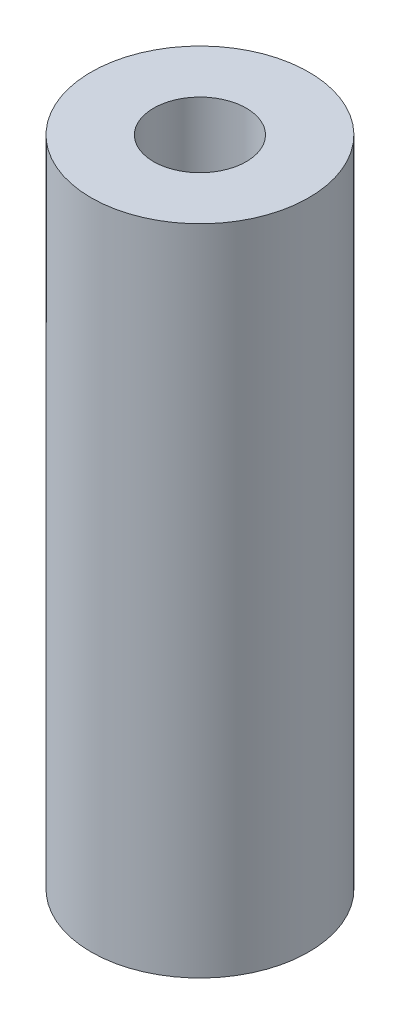
ISO-10303-21;
HEADER;
FILE_DESCRIPTION(('STEP AP214'),'2;1');
FILE_NAME('part.step','',(''),(''),'','','');
FILE_SCHEMA(('AUTOMOTIVE_DESIGN { 1 0 10303 214 1 1 1 1 }'));
ENDSEC;
DATA;
#1=APPLICATION_CONTEXT('core data for automotive mechanical design processes');
#2=APPLICATION_PROTOCOL_DEFINITION('international standard','automotive_design',2000,#1);
#3=PRODUCT_CONTEXT('',#1,'mechanical');
#4=PRODUCT('Part','Part','',(#3));
#5=PRODUCT_RELATED_PRODUCT_CATEGORY('part','',(#4));
#6=PRODUCT_DEFINITION_FORMATION('','',#4);
#7=PRODUCT_DEFINITION_CONTEXT('part definition',#1,'design');
#8=PRODUCT_DEFINITION('design','',#6,#7);
#9=PRODUCT_DEFINITION_SHAPE('','',#8);
#10=(LENGTH_UNIT() NAMED_UNIT(*) SI_UNIT(.MILLI.,.METRE.));
#11=(NAMED_UNIT(*) PLANE_ANGLE_UNIT() SI_UNIT($,.RADIAN.));
#12=(NAMED_UNIT(*) SI_UNIT($,.STERADIAN.) SOLID_ANGLE_UNIT());
#13=UNCERTAINTY_MEASURE_WITH_UNIT(LENGTH_MEASURE(1.E-05),#10,'distance_accuracy_value','');
#14=(GEOMETRIC_REPRESENTATION_CONTEXT(3) GLOBAL_UNCERTAINTY_ASSIGNED_CONTEXT((#13)) GLOBAL_UNIT_ASSIGNED_CONTEXT((#10,
#11,#12)) REPRESENTATION_CONTEXT('',''));
#15=CARTESIAN_POINT('',(0.,0.,0.));
#16=DIRECTION('',(0.,0.,1.));
#17=DIRECTION('',(1.,0.,0.));
#18=AXIS2_PLACEMENT_3D('',#15,#16,#17);
#19=CARTESIAN_POINT('',(0.,19.05,0.));
#20=DIRECTION('',(0.,-1.,0.));
#21=DIRECTION('',(0.,0.,-1.));
#22=AXIS2_PLACEMENT_3D('',#19,#20,#21);
#23=CYLINDRICAL_SURFACE('',#22,3.175);
#24=CARTESIAN_POINT('',(0.,19.05,0.));
#25=DIRECTION('',(0.,1.,0.));
#26=DIRECTION('',(0.,0.,1.));
#27=AXIS2_PLACEMENT_3D('',#24,#25,#26);
#28=CIRCLE('',#27,3.175);
#29=CARTESIAN_POINT('',(0.,19.05,3.17500000000001));
#30=VERTEX_POINT('',#29);
#31=EDGE_CURVE('E10',#30,#30,#28,.T.);
#32=ORIENTED_EDGE('',*,*,#31,.F.);
#33=EDGE_LOOP('',(#32));
#34=FACE_BOUND('',#33,.T.);
#35=CARTESIAN_POINT('',(0.,0.,0.));
#36=DIRECTION('',(0.,1.,0.));
#37=DIRECTION('',(0.,0.,1.));
#38=AXIS2_PLACEMENT_3D('',#35,#36,#37);
#39=CIRCLE('',#38,3.175);
#40=CARTESIAN_POINT('',(0.,0.,3.17500000000001));
#41=VERTEX_POINT('',#40);
#42=EDGE_CURVE('E35',#41,#41,#39,.T.);
#43=ORIENTED_EDGE('',*,*,#42,.T.);
#44=EDGE_LOOP('',(#43));
#45=FACE_BOUND('',#44,.T.);
#46=ADVANCED_FACE('F32',(#34,#45),#23,.T.);
#47=CARTESIAN_POINT('',(0.,19.05,0.));
#48=DIRECTION('',(0.,1.,0.));
#49=DIRECTION('',(0.,0.,1.));
#50=AXIS2_PLACEMENT_3D('',#47,#48,#49);
#51=PLANE('',#50);
#52=CARTESIAN_POINT('',(0.,19.05,0.));
#53=DIRECTION('',(0.,1.,0.));
#54=DIRECTION('',(0.,0.,1.));
#55=AXIS2_PLACEMENT_3D('',#52,#53,#54);
#56=CIRCLE('',#55,1.35254999999999);
#57=CARTESIAN_POINT('',(0.,19.05,1.35254999999999));
#58=VERTEX_POINT('',#57);
#59=EDGE_CURVE('E46',#58,#58,#56,.T.);
#60=ORIENTED_EDGE('',*,*,#59,.F.);
#61=EDGE_LOOP('',(#60));
#62=FACE_BOUND('',#61,.T.);
#63=ORIENTED_EDGE('',*,*,#31,.T.);
#64=EDGE_LOOP('',(#63));
#65=FACE_BOUND('',#64,.T.);
#66=ADVANCED_FACE('F52',(#62,#65),#51,.T.);
#67=CARTESIAN_POINT('',(0.,0.,0.));
#68=DIRECTION('',(0.,1.,0.));
#69=DIRECTION('',(0.,0.,1.));
#70=AXIS2_PLACEMENT_3D('',#67,#68,#69);
#71=PLANE('',#70);
#72=CARTESIAN_POINT('',(0.,0.,0.));
#73=DIRECTION('',(0.,1.,0.));
#74=DIRECTION('',(0.,0.,1.));
#75=AXIS2_PLACEMENT_3D('',#72,#73,#74);
#76=CIRCLE('',#75,1.35254999999999);
#77=CARTESIAN_POINT('',(0.,0.,1.35255));
#78=VERTEX_POINT('',#77);
#79=EDGE_CURVE('E42',#78,#78,#76,.T.);
#80=ORIENTED_EDGE('',*,*,#79,.T.);
#81=EDGE_LOOP('',(#80));
#82=FACE_BOUND('',#81,.T.);
#83=ORIENTED_EDGE('',*,*,#42,.F.);
#84=EDGE_LOOP('',(#83));
#85=FACE_BOUND('',#84,.T.);
#86=ADVANCED_FACE('F54',(#82,#85),#71,.F.);
#87=CARTESIAN_POINT('',(0.,19.05,0.));
#88=DIRECTION('',(0.,1.,0.));
#89=DIRECTION('',(0.,0.,1.));
#90=AXIS2_PLACEMENT_3D('',#87,#88,#89);
#91=CYLINDRICAL_SURFACE('',#90,1.35254999999999);
#92=ORIENTED_EDGE('',*,*,#79,.F.);
#93=EDGE_LOOP('',(#92));
#94=FACE_BOUND('',#93,.T.);
#95=ORIENTED_EDGE('',*,*,#59,.T.);
#96=EDGE_LOOP('',(#95));
#97=FACE_BOUND('',#96,.T.);
#98=ADVANCED_FACE('F50',(#94,#97),#91,.F.);
#99=CLOSED_SHELL('',(#46,#66,#86,#98));
#100=MANIFOLD_SOLID_BREP('B2',#99);
#101=ADVANCED_BREP_SHAPE_REPRESENTATION('',(#18,#100),#14);
#102=SHAPE_DEFINITION_REPRESENTATION(#9,#101);
ENDSEC;
END-ISO-10303-21;
